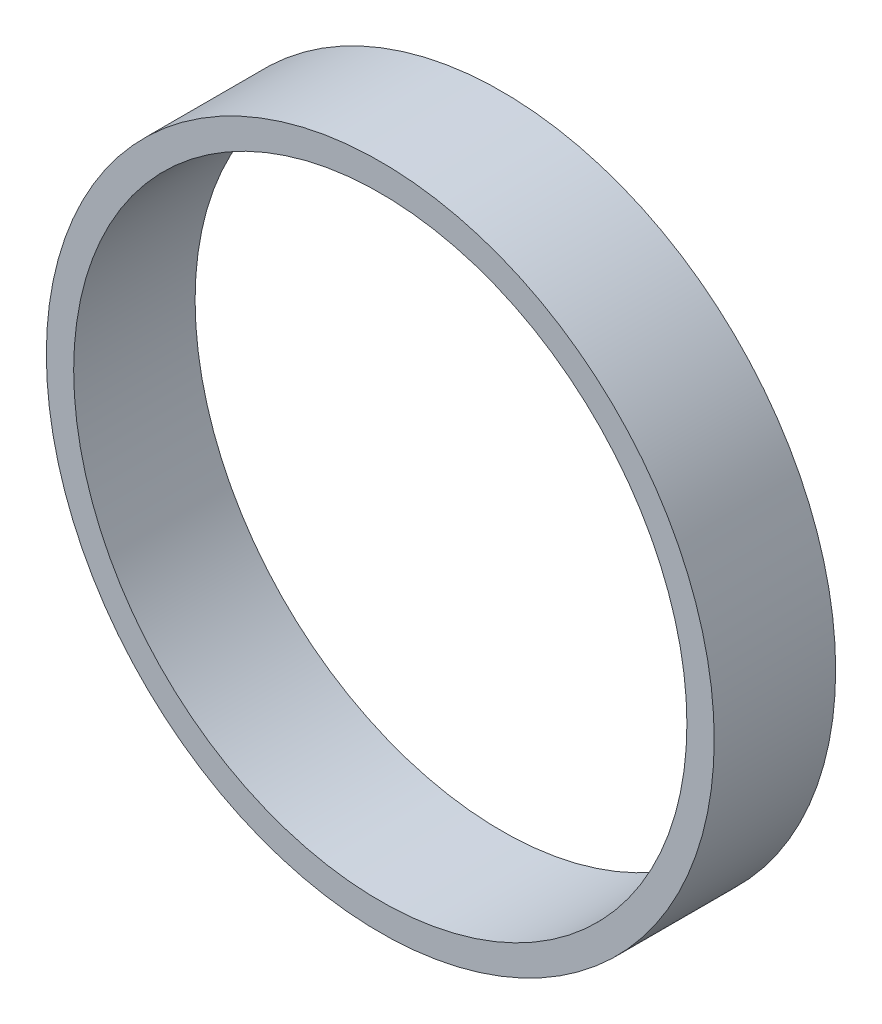
ISO-10303-21;
HEADER;
FILE_DESCRIPTION(('STEP AP214'),'2;1');
FILE_NAME('part.step','',(''),(''),'','','');
FILE_SCHEMA(('AUTOMOTIVE_DESIGN { 1 0 10303 214 1 1 1 1 }'));
ENDSEC;
DATA;
#1=APPLICATION_CONTEXT('core data for automotive mechanical design processes');
#2=APPLICATION_PROTOCOL_DEFINITION('international standard','automotive_design',2000,#1);
#3=PRODUCT_CONTEXT('',#1,'mechanical');
#4=PRODUCT('Part','Part','',(#3));
#5=PRODUCT_RELATED_PRODUCT_CATEGORY('part','',(#4));
#6=PRODUCT_DEFINITION_FORMATION('','',#4);
#7=PRODUCT_DEFINITION_CONTEXT('part definition',#1,'design');
#8=PRODUCT_DEFINITION('design','',#6,#7);
#9=PRODUCT_DEFINITION_SHAPE('','',#8);
#10=(LENGTH_UNIT() NAMED_UNIT(*) SI_UNIT(.MILLI.,.METRE.));
#11=(NAMED_UNIT(*) PLANE_ANGLE_UNIT() SI_UNIT($,.RADIAN.));
#12=(NAMED_UNIT(*) SI_UNIT($,.STERADIAN.) SOLID_ANGLE_UNIT());
#13=UNCERTAINTY_MEASURE_WITH_UNIT(LENGTH_MEASURE(1.E-05),#10,'distance_accuracy_value','');
#14=(GEOMETRIC_REPRESENTATION_CONTEXT(3) GLOBAL_UNCERTAINTY_ASSIGNED_CONTEXT((#13)) GLOBAL_UNIT_ASSIGNED_CONTEXT((#10,
#11,#12)) REPRESENTATION_CONTEXT('',''));
#15=CARTESIAN_POINT('',(0.,0.,0.));
#16=DIRECTION('',(0.,0.,1.));
#17=DIRECTION('',(1.,0.,0.));
#18=AXIS2_PLACEMENT_3D('',#15,#16,#17);
#19=CARTESIAN_POINT('',(0.,0.,2.));
#20=DIRECTION('',(0.,0.,1.));
#21=DIRECTION('',(1.,0.,0.));
#22=AXIS2_PLACEMENT_3D('',#19,#20,#21);
#23=PLANE('',#22);
#24=CARTESIAN_POINT('',(0.,0.,2.));
#25=DIRECTION('',(0.,0.,1.));
#26=DIRECTION('',(1.,0.,0.));
#27=AXIS2_PLACEMENT_3D('',#24,#25,#26);
#28=CIRCLE('',#27,5.5);
#29=CARTESIAN_POINT('',(5.5,0.,2.));
#30=VERTEX_POINT('',#29);
#31=EDGE_CURVE('E10',#30,#30,#28,.T.);
#32=ORIENTED_EDGE('',*,*,#31,.T.);
#33=EDGE_LOOP('',(#32));
#34=FACE_BOUND('',#33,.T.);
#35=CARTESIAN_POINT('',(0.,0.,2.));
#36=DIRECTION('',(0.,0.,1.));
#37=DIRECTION('',(1.,0.,0.));
#38=AXIS2_PLACEMENT_3D('',#35,#36,#37);
#39=CIRCLE('',#38,5.05);
#40=CARTESIAN_POINT('',(5.05,0.,2.));
#41=VERTEX_POINT('',#40);
#42=EDGE_CURVE('E43',#41,#41,#39,.T.);
#43=ORIENTED_EDGE('',*,*,#42,.F.);
#44=EDGE_LOOP('',(#43));
#45=FACE_BOUND('',#44,.T.);
#46=ADVANCED_FACE('F32',(#34,#45),#23,.T.);
#47=CARTESIAN_POINT('',(0.,0.,0.));
#48=DIRECTION('',(0.,0.,1.));
#49=DIRECTION('',(1.,0.,0.));
#50=AXIS2_PLACEMENT_3D('',#47,#48,#49);
#51=PLANE('',#50);
#52=CARTESIAN_POINT('',(0.,0.,0.));
#53=DIRECTION('',(0.,0.,1.));
#54=DIRECTION('',(1.,0.,0.));
#55=AXIS2_PLACEMENT_3D('',#52,#53,#54);
#56=CIRCLE('',#55,5.5);
#57=CARTESIAN_POINT('',(5.5,0.,0.));
#58=VERTEX_POINT('',#57);
#59=EDGE_CURVE('E36',#58,#58,#56,.T.);
#60=ORIENTED_EDGE('',*,*,#59,.F.);
#61=EDGE_LOOP('',(#60));
#62=FACE_BOUND('',#61,.T.);
#63=CARTESIAN_POINT('',(0.,0.,0.));
#64=DIRECTION('',(0.,0.,1.));
#65=DIRECTION('',(1.,0.,0.));
#66=AXIS2_PLACEMENT_3D('',#63,#64,#65);
#67=CIRCLE('',#66,5.05);
#68=CARTESIAN_POINT('',(5.05,0.,0.));
#69=VERTEX_POINT('',#68);
#70=EDGE_CURVE('E45',#69,#69,#67,.T.);
#71=ORIENTED_EDGE('',*,*,#70,.T.);
#72=EDGE_LOOP('',(#71));
#73=FACE_BOUND('',#72,.T.);
#74=ADVANCED_FACE('F55',(#62,#73),#51,.F.);
#75=CARTESIAN_POINT('',(0.,0.,2.));
#76=DIRECTION('',(0.,0.,-1.));
#77=DIRECTION('',(-1.,0.,0.));
#78=AXIS2_PLACEMENT_3D('',#75,#76,#77);
#79=CYLINDRICAL_SURFACE('',#78,5.5);
#80=ORIENTED_EDGE('',*,*,#31,.F.);
#81=EDGE_LOOP('',(#80));
#82=FACE_BOUND('',#81,.T.);
#83=ORIENTED_EDGE('',*,*,#59,.T.);
#84=EDGE_LOOP('',(#83));
#85=FACE_BOUND('',#84,.T.);
#86=ADVANCED_FACE('F34',(#82,#85),#79,.T.);
#87=CARTESIAN_POINT('',(0.,0.,2.));
#88=DIRECTION('',(0.,0.,-1.));
#89=DIRECTION('',(-1.,0.,0.));
#90=AXIS2_PLACEMENT_3D('',#87,#88,#89);
#91=CYLINDRICAL_SURFACE('',#90,5.05);
#92=ORIENTED_EDGE('',*,*,#42,.T.);
#93=EDGE_LOOP('',(#92));
#94=FACE_BOUND('',#93,.T.);
#95=ORIENTED_EDGE('',*,*,#70,.F.);
#96=EDGE_LOOP('',(#95));
#97=FACE_BOUND('',#96,.T.);
#98=ADVANCED_FACE('F51',(#94,#97),#91,.F.);
#99=CLOSED_SHELL('',(#46,#74,#86,#98));
#100=MANIFOLD_SOLID_BREP('B2',#99);
#101=ADVANCED_BREP_SHAPE_REPRESENTATION('',(#18,#100),#14);
#102=SHAPE_DEFINITION_REPRESENTATION(#9,#101);
ENDSEC;
END-ISO-10303-21;
